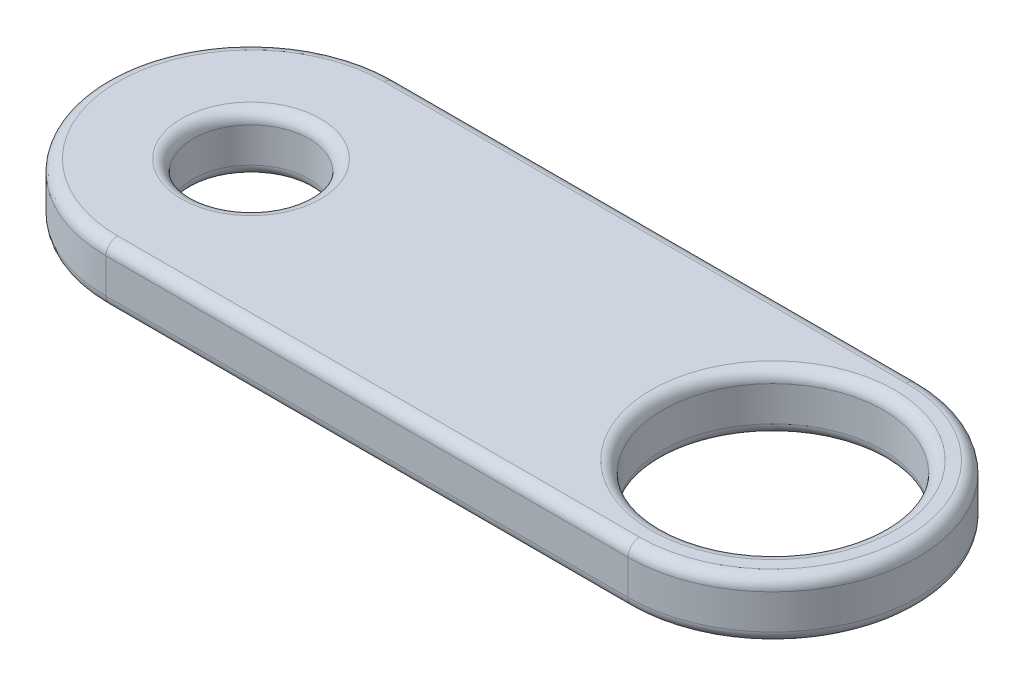
ISO-10303-21;
HEADER;
FILE_DESCRIPTION(('STEP AP214'),'2;1');
FILE_NAME('part.step','',(''),(''),'','','');
FILE_SCHEMA(('AUTOMOTIVE_DESIGN { 1 0 10303 214 1 1 1 1 }'));
ENDSEC;
DATA;
#1=APPLICATION_CONTEXT('core data for automotive mechanical design processes');
#2=APPLICATION_PROTOCOL_DEFINITION('international standard','automotive_design',2000,#1);
#3=PRODUCT_CONTEXT('',#1,'mechanical');
#4=PRODUCT('Part','Part','',(#3));
#5=PRODUCT_RELATED_PRODUCT_CATEGORY('part','',(#4));
#6=PRODUCT_DEFINITION_FORMATION('','',#4);
#7=PRODUCT_DEFINITION_CONTEXT('part definition',#1,'design');
#8=PRODUCT_DEFINITION('design','',#6,#7);
#9=PRODUCT_DEFINITION_SHAPE('','',#8);
#10=(LENGTH_UNIT() NAMED_UNIT(*) SI_UNIT(.MILLI.,.METRE.));
#11=(NAMED_UNIT(*) PLANE_ANGLE_UNIT() SI_UNIT($,.RADIAN.));
#12=(NAMED_UNIT(*) SI_UNIT($,.STERADIAN.) SOLID_ANGLE_UNIT());
#13=UNCERTAINTY_MEASURE_WITH_UNIT(LENGTH_MEASURE(1.E-05),#10,'distance_accuracy_value','');
#14=(GEOMETRIC_REPRESENTATION_CONTEXT(3) GLOBAL_UNCERTAINTY_ASSIGNED_CONTEXT((#13)) GLOBAL_UNIT_ASSIGNED_CONTEXT((#10,
#11,#12)) REPRESENTATION_CONTEXT('',''));
#15=CARTESIAN_POINT('',(0.,0.,0.));
#16=DIRECTION('',(0.,0.,1.));
#17=DIRECTION('',(1.,0.,0.));
#18=AXIS2_PLACEMENT_3D('',#15,#16,#17);
#19=CARTESIAN_POINT('',(45.,5.,0.));
#20=DIRECTION('',(0.,1.,0.));
#21=DIRECTION('',(0.,0.,1.));
#22=AXIS2_PLACEMENT_3D('',#19,#20,#21);
#23=PLANE('',#22);
#24=CARTESIAN_POINT('',(45.,5.,0.));
#25=DIRECTION('',(0.,1.,0.));
#26=DIRECTION('',(0.,0.,1.));
#27=AXIS2_PLACEMENT_3D('',#24,#25,#26);
#28=CIRCLE('',#27,10.5);
#29=CARTESIAN_POINT('',(45.,5.,10.5));
#30=VERTEX_POINT('',#29);
#31=EDGE_CURVE('E140',#30,#30,#28,.F.);
#32=ORIENTED_EDGE('',*,*,#31,.T.);
#33=EDGE_LOOP('',(#32));
#34=FACE_BOUND('',#33,.T.);
#35=CARTESIAN_POINT('',(0.,5.,0.));
#36=DIRECTION('',(0.,1.,0.));
#37=DIRECTION('',(0.,0.,1.));
#38=AXIS2_PLACEMENT_3D('',#35,#36,#37);
#39=CIRCLE('',#38,11.5);
#40=CARTESIAN_POINT('',(0.,5.,-11.5));
#41=VERTEX_POINT('',#40);
#42=CARTESIAN_POINT('',(0.,5.,11.5));
#43=VERTEX_POINT('',#42);
#44=EDGE_CURVE('E137',#41,#43,#39,.T.);
#45=ORIENTED_EDGE('',*,*,#44,.T.);
#46=DIRECTION('',(1.,0.,0.));
#47=VECTOR('',#46,1.);
#48=CARTESIAN_POINT('',(45.,5.,11.5));
#49=LINE('',#48,#47);
#50=CARTESIAN_POINT('',(45.,5.,11.5));
#51=VERTEX_POINT('',#50);
#52=EDGE_CURVE('E116',#43,#51,#49,.T.);
#53=ORIENTED_EDGE('',*,*,#52,.T.);
#54=CARTESIAN_POINT('',(45.,5.,0.));
#55=DIRECTION('',(0.,1.,0.));
#56=DIRECTION('',(0.,0.,1.));
#57=AXIS2_PLACEMENT_3D('',#54,#55,#56);
#58=CIRCLE('',#57,11.5);
#59=CARTESIAN_POINT('',(45.,5.,-11.5));
#60=VERTEX_POINT('',#59);
#61=EDGE_CURVE('E125',#51,#60,#58,.T.);
#62=ORIENTED_EDGE('',*,*,#61,.T.);
#63=DIRECTION('',(-1.,0.,0.));
#64=VECTOR('',#63,1.);
#65=CARTESIAN_POINT('',(0.,5.,-11.5));
#66=LINE('',#65,#64);
#67=EDGE_CURVE('E132',#60,#41,#66,.T.);
#68=ORIENTED_EDGE('',*,*,#67,.T.);
#69=EDGE_LOOP('',(#45,#53,#62,#68));
#70=FACE_BOUND('',#69,.T.);
#71=CARTESIAN_POINT('',(0.,5.,0.));
#72=DIRECTION('',(0.,1.,0.));
#73=DIRECTION('',(0.,0.,1.));
#74=AXIS2_PLACEMENT_3D('',#71,#72,#73);
#75=CIRCLE('',#74,6.);
#76=CARTESIAN_POINT('',(0.,5.,6.));
#77=VERTEX_POINT('',#76);
#78=EDGE_CURVE('E133',#77,#77,#75,.F.);
#79=ORIENTED_EDGE('',*,*,#78,.T.);
#80=EDGE_LOOP('',(#79));
#81=FACE_BOUND('',#80,.T.);
#82=ADVANCED_FACE('F43',(#34,#70,#81),#23,.T.);
#83=CARTESIAN_POINT('',(45.,0.,0.));
#84=DIRECTION('',(0.,1.,0.));
#85=DIRECTION('',(0.,0.,1.));
#86=AXIS2_PLACEMENT_3D('',#83,#84,#85);
#87=PLANE('',#86);
#88=CARTESIAN_POINT('',(45.,0.,0.));
#89=DIRECTION('',(0.,1.,0.));
#90=DIRECTION('',(0.,0.,1.));
#91=AXIS2_PLACEMENT_3D('',#88,#89,#90);
#92=CIRCLE('',#91,10.5);
#93=CARTESIAN_POINT('',(45.,0.,10.5));
#94=VERTEX_POINT('',#93);
#95=EDGE_CURVE('E11',#94,#94,#92,.T.);
#96=ORIENTED_EDGE('',*,*,#95,.T.);
#97=EDGE_LOOP('',(#96));
#98=FACE_BOUND('',#97,.T.);
#99=CARTESIAN_POINT('',(0.,0.,0.));
#100=DIRECTION('',(0.,1.,0.));
#101=DIRECTION('',(0.,0.,1.));
#102=AXIS2_PLACEMENT_3D('',#99,#100,#101);
#103=CIRCLE('',#102,6.);
#104=CARTESIAN_POINT('',(0.,0.,6.));
#105=VERTEX_POINT('',#104);
#106=EDGE_CURVE('E53',#105,#105,#103,.T.);
#107=ORIENTED_EDGE('',*,*,#106,.T.);
#108=EDGE_LOOP('',(#107));
#109=FACE_BOUND('',#108,.T.);
#110=CARTESIAN_POINT('',(0.,0.,0.));
#111=DIRECTION('',(0.,1.,0.));
#112=DIRECTION('',(0.,0.,1.));
#113=AXIS2_PLACEMENT_3D('',#110,#111,#112);
#114=CIRCLE('',#113,11.5);
#115=CARTESIAN_POINT('',(0.,0.,11.5));
#116=VERTEX_POINT('',#115);
#117=CARTESIAN_POINT('',(0.,0.,-11.5));
#118=VERTEX_POINT('',#117);
#119=EDGE_CURVE('E61',#116,#118,#114,.F.);
#120=ORIENTED_EDGE('',*,*,#119,.T.);
#121=DIRECTION('',(-1.,0.,0.));
#122=VECTOR('',#121,1.);
#123=CARTESIAN_POINT('',(45.,0.,-11.5));
#124=LINE('',#123,#122);
#125=CARTESIAN_POINT('',(45.,0.,-11.5));
#126=VERTEX_POINT('',#125);
#127=EDGE_CURVE('E189',#118,#126,#124,.F.);
#128=ORIENTED_EDGE('',*,*,#127,.T.);
#129=CARTESIAN_POINT('',(45.,0.,0.));
#130=DIRECTION('',(0.,1.,0.));
#131=DIRECTION('',(0.,0.,1.));
#132=AXIS2_PLACEMENT_3D('',#129,#130,#131);
#133=CIRCLE('',#132,11.5);
#134=CARTESIAN_POINT('',(45.,0.,11.5));
#135=VERTEX_POINT('',#134);
#136=EDGE_CURVE('E182',#126,#135,#133,.F.);
#137=ORIENTED_EDGE('',*,*,#136,.T.);
#138=DIRECTION('',(1.,0.,0.));
#139=VECTOR('',#138,1.);
#140=CARTESIAN_POINT('',(45.,0.,11.5));
#141=LINE('',#140,#139);
#142=EDGE_CURVE('E66',#135,#116,#141,.F.);
#143=ORIENTED_EDGE('',*,*,#142,.T.);
#144=EDGE_LOOP('',(#120,#128,#137,#143));
#145=FACE_BOUND('',#144,.T.);
#146=ADVANCED_FACE('F231',(#98,#109,#145),#87,.F.);
#147=CARTESIAN_POINT('',(45.,5.,0.));
#148=DIRECTION('',(0.,-1.,0.));
#149=DIRECTION('',(0.,0.,-1.));
#150=AXIS2_PLACEMENT_3D('',#147,#148,#149);
#151=CYLINDRICAL_SURFACE('',#150,12.5);
#152=DIRECTION('',(0.,-1.,0.));
#153=VECTOR('',#152,1.);
#154=CARTESIAN_POINT('',(45.,5.,-12.5));
#155=LINE('',#154,#153);
#156=CARTESIAN_POINT('',(45.,4.,-12.5));
#157=VERTEX_POINT('',#156);
#158=CARTESIAN_POINT('',(45.,1.,-12.5));
#159=VERTEX_POINT('',#158);
#160=EDGE_CURVE('E471',#157,#159,#155,.T.);
#161=ORIENTED_EDGE('',*,*,#160,.F.);
#162=CARTESIAN_POINT('',(45.,4.,0.));
#163=DIRECTION('',(0.,1.,0.));
#164=DIRECTION('',(0.,0.,1.));
#165=AXIS2_PLACEMENT_3D('',#162,#163,#164);
#166=CIRCLE('',#165,12.5);
#167=CARTESIAN_POINT('',(45.,4.,12.5));
#168=VERTEX_POINT('',#167);
#169=EDGE_CURVE('E171',#157,#168,#166,.F.);
#170=ORIENTED_EDGE('',*,*,#169,.T.);
#171=DIRECTION('',(0.,-1.,0.));
#172=VECTOR('',#171,1.);
#173=CARTESIAN_POINT('',(45.,5.,12.5));
#174=LINE('',#173,#172);
#175=CARTESIAN_POINT('',(45.,1.,12.5));
#176=VERTEX_POINT('',#175);
#177=EDGE_CURVE('E203',#168,#176,#174,.T.);
#178=ORIENTED_EDGE('',*,*,#177,.T.);
#179=CARTESIAN_POINT('',(45.,1.,0.));
#180=DIRECTION('',(0.,1.,0.));
#181=DIRECTION('',(0.,0.,1.));
#182=AXIS2_PLACEMENT_3D('',#179,#180,#181);
#183=CIRCLE('',#182,12.5);
#184=EDGE_CURVE('E168',#176,#159,#183,.T.);
#185=ORIENTED_EDGE('',*,*,#184,.T.);
#186=EDGE_LOOP('',(#161,#170,#178,#185));
#187=FACE_BOUND('',#186,.T.);
#188=ADVANCED_FACE('F233',(#187),#151,.T.);
#189=CARTESIAN_POINT('',(45.,5.,-12.5));
#190=DIRECTION('',(0.,0.,1.));
#191=DIRECTION('',(1.,0.,0.));
#192=AXIS2_PLACEMENT_3D('',#189,#190,#191);
#193=PLANE('',#192);
#194=DIRECTION('',(0.,-1.,0.));
#195=VECTOR('',#194,1.);
#196=CARTESIAN_POINT('',(0.,5.,-12.5));
#197=LINE('',#196,#195);
#198=CARTESIAN_POINT('',(0.,4.,-12.5));
#199=VERTEX_POINT('',#198);
#200=CARTESIAN_POINT('',(0.,1.,-12.5));
#201=VERTEX_POINT('',#200);
#202=EDGE_CURVE('E478',#199,#201,#197,.T.);
#203=ORIENTED_EDGE('',*,*,#202,.F.);
#204=DIRECTION('',(-1.,0.,0.));
#205=VECTOR('',#204,1.);
#206=CARTESIAN_POINT('',(45.,4.,-12.5));
#207=LINE('',#206,#205);
#208=EDGE_CURVE('E165',#199,#157,#207,.F.);
#209=ORIENTED_EDGE('',*,*,#208,.T.);
#210=ORIENTED_EDGE('',*,*,#160,.T.);
#211=DIRECTION('',(-1.,0.,0.));
#212=VECTOR('',#211,1.);
#213=CARTESIAN_POINT('',(45.,1.,-12.5));
#214=LINE('',#213,#212);
#215=EDGE_CURVE('E161',#159,#201,#214,.T.);
#216=ORIENTED_EDGE('',*,*,#215,.T.);
#217=EDGE_LOOP('',(#203,#209,#210,#216));
#218=FACE_BOUND('',#217,.T.);
#219=ADVANCED_FACE('F240',(#218),#193,.F.);
#220=CARTESIAN_POINT('',(0.,5.,0.));
#221=DIRECTION('',(0.,-1.,0.));
#222=DIRECTION('',(0.,0.,-1.));
#223=AXIS2_PLACEMENT_3D('',#220,#221,#222);
#224=CYLINDRICAL_SURFACE('',#223,12.5);
#225=DIRECTION('',(0.,-1.,0.));
#226=VECTOR('',#225,1.);
#227=CARTESIAN_POINT('',(0.,5.,12.5));
#228=LINE('',#227,#226);
#229=CARTESIAN_POINT('',(0.,4.,12.5));
#230=VERTEX_POINT('',#229);
#231=CARTESIAN_POINT('',(0.,1.,12.5));
#232=VERTEX_POINT('',#231);
#233=EDGE_CURVE('E494',#230,#232,#228,.T.);
#234=ORIENTED_EDGE('',*,*,#233,.F.);
#235=CARTESIAN_POINT('',(0.,4.,0.));
#236=DIRECTION('',(0.,1.,0.));
#237=DIRECTION('',(0.,0.,1.));
#238=AXIS2_PLACEMENT_3D('',#235,#236,#237);
#239=CIRCLE('',#238,12.5);
#240=EDGE_CURVE('E158',#230,#199,#239,.F.);
#241=ORIENTED_EDGE('',*,*,#240,.T.);
#242=ORIENTED_EDGE('',*,*,#202,.T.);
#243=CARTESIAN_POINT('',(0.,1.,0.));
#244=DIRECTION('',(0.,1.,0.));
#245=DIRECTION('',(0.,0.,1.));
#246=AXIS2_PLACEMENT_3D('',#243,#244,#245);
#247=CIRCLE('',#246,12.5);
#248=EDGE_CURVE('E155',#201,#232,#247,.T.);
#249=ORIENTED_EDGE('',*,*,#248,.T.);
#250=EDGE_LOOP('',(#234,#241,#242,#249));
#251=FACE_BOUND('',#250,.T.);
#252=ADVANCED_FACE('F252',(#251),#224,.T.);
#253=CARTESIAN_POINT('',(0.,5.,12.5));
#254=DIRECTION('',(0.,0.,-1.));
#255=DIRECTION('',(-1.,0.,0.));
#256=AXIS2_PLACEMENT_3D('',#253,#254,#255);
#257=PLANE('',#256);
#258=ORIENTED_EDGE('',*,*,#177,.F.);
#259=DIRECTION('',(1.,0.,0.));
#260=VECTOR('',#259,1.);
#261=CARTESIAN_POINT('',(0.,4.,12.5));
#262=LINE('',#261,#260);
#263=EDGE_CURVE('E118',#168,#230,#262,.F.);
#264=ORIENTED_EDGE('',*,*,#263,.T.);
#265=ORIENTED_EDGE('',*,*,#233,.T.);
#266=DIRECTION('',(1.,0.,0.));
#267=VECTOR('',#266,1.);
#268=CARTESIAN_POINT('',(0.,1.,12.5));
#269=LINE('',#268,#267);
#270=EDGE_CURVE('E146',#232,#176,#269,.T.);
#271=ORIENTED_EDGE('',*,*,#270,.T.);
#272=EDGE_LOOP('',(#258,#264,#265,#271));
#273=FACE_BOUND('',#272,.T.);
#274=ADVANCED_FACE('F248',(#273),#257,.F.);
#275=CARTESIAN_POINT('',(0.,5.,0.));
#276=DIRECTION('',(0.,-1.,0.));
#277=DIRECTION('',(0.,0.,-1.));
#278=AXIS2_PLACEMENT_3D('',#275,#276,#277);
#279=CYLINDRICAL_SURFACE('',#278,5.);
#280=CARTESIAN_POINT('',(0.,4.,0.));
#281=DIRECTION('',(0.,1.,0.));
#282=DIRECTION('',(0.,0.,1.));
#283=AXIS2_PLACEMENT_3D('',#280,#281,#282);
#284=CIRCLE('',#283,5.);
#285=CARTESIAN_POINT('',(0.,4.,5.));
#286=VERTEX_POINT('',#285);
#287=EDGE_CURVE('E178',#286,#286,#284,.T.);
#288=ORIENTED_EDGE('',*,*,#287,.T.);
#289=EDGE_LOOP('',(#288));
#290=FACE_BOUND('',#289,.T.);
#291=CARTESIAN_POINT('',(0.,1.,0.));
#292=DIRECTION('',(0.,1.,0.));
#293=DIRECTION('',(0.,0.,1.));
#294=AXIS2_PLACEMENT_3D('',#291,#292,#293);
#295=CIRCLE('',#294,5.);
#296=CARTESIAN_POINT('',(0.,1.,5.));
#297=VERTEX_POINT('',#296);
#298=EDGE_CURVE('E174',#297,#297,#295,.F.);
#299=ORIENTED_EDGE('',*,*,#298,.T.);
#300=EDGE_LOOP('',(#299));
#301=FACE_BOUND('',#300,.T.);
#302=ADVANCED_FACE('F251',(#290,#301),#279,.F.);
#303=CARTESIAN_POINT('',(45.,5.,0.));
#304=DIRECTION('',(0.,-1.,0.));
#305=DIRECTION('',(0.,0.,-1.));
#306=AXIS2_PLACEMENT_3D('',#303,#304,#305);
#307=CYLINDRICAL_SURFACE('',#306,9.5);
#308=CARTESIAN_POINT('',(45.,4.,0.));
#309=DIRECTION('',(0.,1.,0.));
#310=DIRECTION('',(0.,0.,1.));
#311=AXIS2_PLACEMENT_3D('',#308,#309,#310);
#312=CIRCLE('',#311,9.5);
#313=CARTESIAN_POINT('',(45.,4.,9.49999999999999));
#314=VERTEX_POINT('',#313);
#315=EDGE_CURVE('E466',#314,#314,#312,.T.);
#316=ORIENTED_EDGE('',*,*,#315,.T.);
#317=EDGE_LOOP('',(#316));
#318=FACE_BOUND('',#317,.T.);
#319=CARTESIAN_POINT('',(45.,1.,0.));
#320=DIRECTION('',(0.,1.,0.));
#321=DIRECTION('',(0.,0.,1.));
#322=AXIS2_PLACEMENT_3D('',#319,#320,#321);
#323=CIRCLE('',#322,9.5);
#324=CARTESIAN_POINT('',(45.,1.,9.49999999999999));
#325=VERTEX_POINT('',#324);
#326=EDGE_CURVE('E469',#325,#325,#323,.F.);
#327=ORIENTED_EDGE('',*,*,#326,.T.);
#328=EDGE_LOOP('',(#327));
#329=FACE_BOUND('',#328,.T.);
#330=ADVANCED_FACE('F264',(#318,#329),#307,.F.);
#331=CARTESIAN_POINT('',(45.,4.,0.));
#332=DIRECTION('',(0.,1.,0.));
#333=DIRECTION('',(0.,0.,1.));
#334=AXIS2_PLACEMENT_3D('',#331,#332,#333);
#335=TOROIDAL_SURFACE('',#334,10.5,1.);
#336=ORIENTED_EDGE('',*,*,#31,.F.);
#337=EDGE_LOOP('',(#336));
#338=FACE_BOUND('',#337,.T.);
#339=ORIENTED_EDGE('',*,*,#315,.F.);
#340=EDGE_LOOP('',(#339));
#341=FACE_BOUND('',#340,.T.);
#342=ADVANCED_FACE('F260',(#338,#341),#335,.T.);
#343=CARTESIAN_POINT('',(45.,4.,-11.5));
#344=DIRECTION('',(1.,0.,0.));
#345=DIRECTION('',(0.,0.,-1.));
#346=AXIS2_PLACEMENT_3D('',#343,#344,#345);
#347=CYLINDRICAL_SURFACE('',#346,1.);
#348=CARTESIAN_POINT('',(45.,4.,-11.5));
#349=DIRECTION('',(1.,0.,0.));
#350=DIRECTION('',(0.,0.,-1.));
#351=AXIS2_PLACEMENT_3D('',#348,#349,#350);
#352=CIRCLE('',#351,1.);
#353=EDGE_CURVE('E128',#157,#60,#352,.T.);
#354=ORIENTED_EDGE('',*,*,#353,.F.);
#355=ORIENTED_EDGE('',*,*,#208,.F.);
#356=CARTESIAN_POINT('',(0.,4.,-11.5));
#357=DIRECTION('',(-1.,0.,0.));
#358=DIRECTION('',(0.,0.,1.));
#359=AXIS2_PLACEMENT_3D('',#356,#357,#358);
#360=CIRCLE('',#359,1.);
#361=EDGE_CURVE('E199',#41,#199,#360,.T.);
#362=ORIENTED_EDGE('',*,*,#361,.F.);
#363=ORIENTED_EDGE('',*,*,#67,.F.);
#364=EDGE_LOOP('',(#354,#355,#362,#363));
#365=FACE_BOUND('',#364,.T.);
#366=ADVANCED_FACE('F263',(#365),#347,.T.);
#367=CARTESIAN_POINT('',(0.,4.,0.));
#368=DIRECTION('',(0.,1.,0.));
#369=DIRECTION('',(0.,0.,1.));
#370=AXIS2_PLACEMENT_3D('',#367,#368,#369);
#371=TOROIDAL_SURFACE('',#370,11.5,1.);
#372=ORIENTED_EDGE('',*,*,#361,.T.);
#373=ORIENTED_EDGE('',*,*,#240,.F.);
#374=CARTESIAN_POINT('',(0.,4.,11.5));
#375=DIRECTION('',(1.,0.,0.));
#376=DIRECTION('',(0.,0.,-1.));
#377=AXIS2_PLACEMENT_3D('',#374,#375,#376);
#378=CIRCLE('',#377,1.);
#379=EDGE_CURVE('E122',#43,#230,#378,.T.);
#380=ORIENTED_EDGE('',*,*,#379,.F.);
#381=ORIENTED_EDGE('',*,*,#44,.F.);
#382=EDGE_LOOP('',(#372,#373,#380,#381));
#383=FACE_BOUND('',#382,.T.);
#384=ADVANCED_FACE('F271',(#383),#371,.T.);
#385=CARTESIAN_POINT('',(45.,4.,0.));
#386=DIRECTION('',(0.,1.,0.));
#387=DIRECTION('',(0.,0.,1.));
#388=AXIS2_PLACEMENT_3D('',#385,#386,#387);
#389=TOROIDAL_SURFACE('',#388,11.5,1.);
#390=ORIENTED_EDGE('',*,*,#353,.T.);
#391=ORIENTED_EDGE('',*,*,#61,.F.);
#392=CARTESIAN_POINT('',(45.,4.,11.5));
#393=DIRECTION('',(-1.,0.,0.));
#394=DIRECTION('',(0.,0.,1.));
#395=AXIS2_PLACEMENT_3D('',#392,#393,#394);
#396=CIRCLE('',#395,1.);
#397=EDGE_CURVE('E112',#168,#51,#396,.T.);
#398=ORIENTED_EDGE('',*,*,#397,.F.);
#399=ORIENTED_EDGE('',*,*,#169,.F.);
#400=EDGE_LOOP('',(#390,#391,#398,#399));
#401=FACE_BOUND('',#400,.T.);
#402=ADVANCED_FACE('F126',(#401),#389,.T.);
#403=CARTESIAN_POINT('',(45.,4.,11.5));
#404=DIRECTION('',(-1.,0.,0.));
#405=DIRECTION('',(0.,0.,1.));
#406=AXIS2_PLACEMENT_3D('',#403,#404,#405);
#407=CYLINDRICAL_SURFACE('',#406,1.);
#408=ORIENTED_EDGE('',*,*,#379,.T.);
#409=ORIENTED_EDGE('',*,*,#263,.F.);
#410=ORIENTED_EDGE('',*,*,#397,.T.);
#411=ORIENTED_EDGE('',*,*,#52,.F.);
#412=EDGE_LOOP('',(#408,#409,#410,#411));
#413=FACE_BOUND('',#412,.T.);
#414=ADVANCED_FACE('F114',(#413),#407,.T.);
#415=CARTESIAN_POINT('',(0.,4.,0.));
#416=DIRECTION('',(0.,1.,0.));
#417=DIRECTION('',(0.,0.,1.));
#418=AXIS2_PLACEMENT_3D('',#415,#416,#417);
#419=TOROIDAL_SURFACE('',#418,6.,1.);
#420=ORIENTED_EDGE('',*,*,#78,.F.);
#421=EDGE_LOOP('',(#420));
#422=FACE_BOUND('',#421,.T.);
#423=ORIENTED_EDGE('',*,*,#287,.F.);
#424=EDGE_LOOP('',(#423));
#425=FACE_BOUND('',#424,.T.);
#426=ADVANCED_FACE('F268',(#422,#425),#419,.T.);
#427=CARTESIAN_POINT('',(45.,1.,0.));
#428=DIRECTION('',(0.,1.,0.));
#429=DIRECTION('',(0.,0.,1.));
#430=AXIS2_PLACEMENT_3D('',#427,#428,#429);
#431=TOROIDAL_SURFACE('',#430,10.5,1.);
#432=ORIENTED_EDGE('',*,*,#326,.F.);
#433=EDGE_LOOP('',(#432));
#434=FACE_BOUND('',#433,.T.);
#435=ORIENTED_EDGE('',*,*,#95,.F.);
#436=EDGE_LOOP('',(#435));
#437=FACE_BOUND('',#436,.T.);
#438=ADVANCED_FACE('F280',(#434,#437),#431,.T.);
#439=CARTESIAN_POINT('',(0.,1.,0.));
#440=DIRECTION('',(0.,1.,0.));
#441=DIRECTION('',(0.,0.,1.));
#442=AXIS2_PLACEMENT_3D('',#439,#440,#441);
#443=TOROIDAL_SURFACE('',#442,6.,1.);
#444=ORIENTED_EDGE('',*,*,#298,.F.);
#445=EDGE_LOOP('',(#444));
#446=FACE_BOUND('',#445,.T.);
#447=ORIENTED_EDGE('',*,*,#106,.F.);
#448=EDGE_LOOP('',(#447));
#449=FACE_BOUND('',#448,.T.);
#450=ADVANCED_FACE('F284',(#446,#449),#443,.T.);
#451=CARTESIAN_POINT('',(0.,1.,11.5));
#452=DIRECTION('',(1.,0.,0.));
#453=DIRECTION('',(0.,0.,-1.));
#454=AXIS2_PLACEMENT_3D('',#451,#452,#453);
#455=CYLINDRICAL_SURFACE('',#454,1.);
#456=CARTESIAN_POINT('',(0.,1.,11.5));
#457=DIRECTION('',(-1.,0.,0.));
#458=DIRECTION('',(0.,0.,1.));
#459=AXIS2_PLACEMENT_3D('',#456,#457,#458);
#460=CIRCLE('',#459,1.);
#461=EDGE_CURVE('E209',#116,#232,#460,.T.);
#462=ORIENTED_EDGE('',*,*,#461,.F.);
#463=ORIENTED_EDGE('',*,*,#142,.F.);
#464=CARTESIAN_POINT('',(45.,1.,11.5));
#465=DIRECTION('',(1.,0.,0.));
#466=DIRECTION('',(0.,0.,-1.));
#467=AXIS2_PLACEMENT_3D('',#464,#465,#466);
#468=CIRCLE('',#467,1.);
#469=EDGE_CURVE('E47',#176,#135,#468,.T.);
#470=ORIENTED_EDGE('',*,*,#469,.F.);
#471=ORIENTED_EDGE('',*,*,#270,.F.);
#472=EDGE_LOOP('',(#462,#463,#470,#471));
#473=FACE_BOUND('',#472,.T.);
#474=ADVANCED_FACE('F45',(#473),#455,.T.);
#475=CARTESIAN_POINT('',(45.,1.,0.));
#476=DIRECTION('',(0.,1.,0.));
#477=DIRECTION('',(0.,0.,1.));
#478=AXIS2_PLACEMENT_3D('',#475,#476,#477);
#479=TOROIDAL_SURFACE('',#478,11.5,1.);
#480=ORIENTED_EDGE('',*,*,#469,.T.);
#481=ORIENTED_EDGE('',*,*,#136,.F.);
#482=CARTESIAN_POINT('',(45.,1.,-11.5));
#483=DIRECTION('',(-1.,0.,0.));
#484=DIRECTION('',(0.,0.,1.));
#485=AXIS2_PLACEMENT_3D('',#482,#483,#484);
#486=CIRCLE('',#485,1.);
#487=EDGE_CURVE('E207',#159,#126,#486,.T.);
#488=ORIENTED_EDGE('',*,*,#487,.F.);
#489=ORIENTED_EDGE('',*,*,#184,.F.);
#490=EDGE_LOOP('',(#480,#481,#488,#489));
#491=FACE_BOUND('',#490,.T.);
#492=ADVANCED_FACE('F222',(#491),#479,.T.);
#493=CARTESIAN_POINT('',(0.,1.,0.));
#494=DIRECTION('',(0.,1.,0.));
#495=DIRECTION('',(0.,0.,1.));
#496=AXIS2_PLACEMENT_3D('',#493,#494,#495);
#497=TOROIDAL_SURFACE('',#496,11.5,1.);
#498=ORIENTED_EDGE('',*,*,#461,.T.);
#499=ORIENTED_EDGE('',*,*,#248,.F.);
#500=CARTESIAN_POINT('',(0.,1.,-11.5));
#501=DIRECTION('',(1.,0.,0.));
#502=DIRECTION('',(0.,0.,-1.));
#503=AXIS2_PLACEMENT_3D('',#500,#501,#502);
#504=CIRCLE('',#503,1.);
#505=EDGE_CURVE('E204',#118,#201,#504,.T.);
#506=ORIENTED_EDGE('',*,*,#505,.F.);
#507=ORIENTED_EDGE('',*,*,#119,.F.);
#508=EDGE_LOOP('',(#498,#499,#506,#507));
#509=FACE_BOUND('',#508,.T.);
#510=ADVANCED_FACE('F227',(#509),#497,.T.);
#511=CARTESIAN_POINT('',(45.,1.,-11.5));
#512=DIRECTION('',(-1.,0.,0.));
#513=DIRECTION('',(0.,0.,1.));
#514=AXIS2_PLACEMENT_3D('',#511,#512,#513);
#515=CYLINDRICAL_SURFACE('',#514,1.);
#516=ORIENTED_EDGE('',*,*,#487,.T.);
#517=ORIENTED_EDGE('',*,*,#127,.F.);
#518=ORIENTED_EDGE('',*,*,#505,.T.);
#519=ORIENTED_EDGE('',*,*,#215,.F.);
#520=EDGE_LOOP('',(#516,#517,#518,#519));
#521=FACE_BOUND('',#520,.T.);
#522=ADVANCED_FACE('F230',(#521),#515,.T.);
#523=CLOSED_SHELL('',(#82,#146,#188,#219,#252,#274,#302,#330,#342,#366,#384,#402,#414,#426,#438,
#450,#474,#492,#510,#522));
#524=MANIFOLD_SOLID_BREP('B2',#523);
#525=ADVANCED_BREP_SHAPE_REPRESENTATION('',(#18,#524),#14);
#526=SHAPE_DEFINITION_REPRESENTATION(#9,#525);
ENDSEC;
END-ISO-10303-21;
